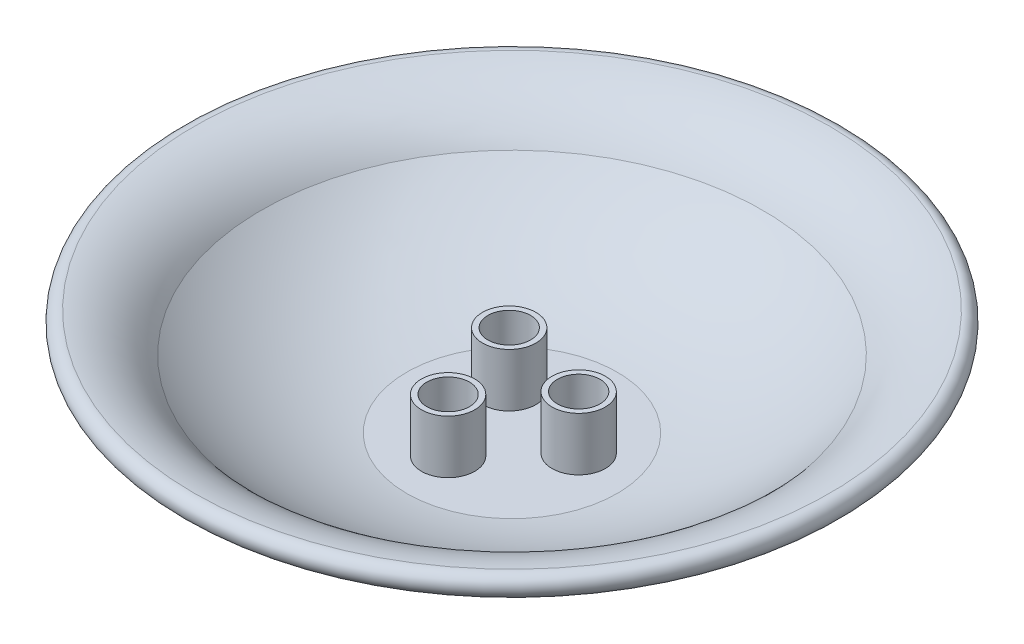
ISO-10303-21;
HEADER;
FILE_DESCRIPTION(('STEP AP214'),'2;1');
FILE_NAME('part.step','',(''),(''),'','','');
FILE_SCHEMA(('AUTOMOTIVE_DESIGN { 1 0 10303 214 1 1 1 1 }'));
ENDSEC;
DATA;
#1=APPLICATION_CONTEXT('core data for automotive mechanical design processes');
#2=APPLICATION_PROTOCOL_DEFINITION('international standard','automotive_design',2000,#1);
#3=PRODUCT_CONTEXT('',#1,'mechanical');
#4=PRODUCT('Part','Part','',(#3));
#5=PRODUCT_RELATED_PRODUCT_CATEGORY('part','',(#4));
#6=PRODUCT_DEFINITION_FORMATION('','',#4);
#7=PRODUCT_DEFINITION_CONTEXT('part definition',#1,'design');
#8=PRODUCT_DEFINITION('design','',#6,#7);
#9=PRODUCT_DEFINITION_SHAPE('','',#8);
#10=(LENGTH_UNIT() NAMED_UNIT(*) SI_UNIT(.MILLI.,.METRE.));
#11=(NAMED_UNIT(*) PLANE_ANGLE_UNIT() SI_UNIT($,.RADIAN.));
#12=(NAMED_UNIT(*) SI_UNIT($,.STERADIAN.) SOLID_ANGLE_UNIT());
#13=UNCERTAINTY_MEASURE_WITH_UNIT(LENGTH_MEASURE(1.E-05),#10,'distance_accuracy_value','');
#14=(GEOMETRIC_REPRESENTATION_CONTEXT(3) GLOBAL_UNCERTAINTY_ASSIGNED_CONTEXT((#13)) GLOBAL_UNIT_ASSIGNED_CONTEXT((#10,
#11,#12)) REPRESENTATION_CONTEXT('',''));
#15=CARTESIAN_POINT('',(0.,0.,0.));
#16=DIRECTION('',(0.,0.,1.));
#17=DIRECTION('',(1.,0.,0.));
#18=AXIS2_PLACEMENT_3D('',#15,#16,#17);
#19=CARTESIAN_POINT('',(13.1192660550459,6.17806077003984,0.));
#20=DIRECTION('',(0.,1.,0.));
#21=DIRECTION('',(0.,0.,1.));
#22=AXIS2_PLACEMENT_3D('',#19,#20,#21);
#23=TOROIDAL_SURFACE('',#22,29.8959735549191,1.);
#24=CARTESIAN_POINT('',(13.1192660550459,5.18348623853211,0.));
#25=DIRECTION('',(0.,1.,0.));
#26=DIRECTION('',(0.,0.,1.));
#27=AXIS2_PLACEMENT_3D('',#24,#25,#26);
#28=CIRCLE('',#27,30.);
#29=CARTESIAN_POINT('',(13.1192660550459,5.18348623853211,30.));
#30=VERTEX_POINT('',#29);
#31=EDGE_CURVE('E93',#30,#30,#28,.T.);
#32=ORIENTED_EDGE('',*,*,#31,.T.);
#33=EDGE_LOOP('',(#32));
#34=FACE_BOUND('',#33,.T.);
#35=CARTESIAN_POINT('',(13.1192660550459,7.17263530154758,0.));
#36=DIRECTION('',(0.,1.,0.));
#37=DIRECTION('',(0.,0.,1.));
#38=AXIS2_PLACEMENT_3D('',#35,#36,#37);
#39=CIRCLE('',#38,29.7919471098382);
#40=CARTESIAN_POINT('',(13.1192660550459,7.17263530154758,29.7919471098382));
#41=VERTEX_POINT('',#40);
#42=EDGE_CURVE('E10',#41,#41,#39,.T.);
#43=ORIENTED_EDGE('',*,*,#42,.F.);
#44=EDGE_LOOP('',(#43));
#45=FACE_BOUND('',#44,.T.);
#46=ADVANCED_FACE('F40',(#34,#45),#23,.T.);
#47=CARTESIAN_POINT('',(13.1192660550459,-1.67957037368538,0.));
#48=DIRECTION('',(0.,1.,0.));
#49=DIRECTION('',(0.,0.,1.));
#50=AXIS2_PLACEMENT_3D('',#47,#48,#49);
#51=TOROIDAL_SURFACE('',#50,30.7178339673305,8.90049503058699);
#52=ORIENTED_EDGE('',*,*,#42,.T.);
#53=EDGE_LOOP('',(#52));
#54=FACE_BOUND('',#53,.T.);
#55=CARTESIAN_POINT('',(13.1192660550459,3.51639603535897,0.));
#56=DIRECTION('',(0.,1.,0.));
#57=DIRECTION('',(0.,0.,1.));
#58=AXIS2_PLACEMENT_3D('',#55,#56,#57);
#59=CIRCLE('',#58,23.4914417232306);
#60=CARTESIAN_POINT('',(13.1192660550459,3.51639603535897,23.4914417232306));
#61=VERTEX_POINT('',#60);
#62=EDGE_CURVE('E47',#61,#61,#59,.T.);
#63=ORIENTED_EDGE('',*,*,#62,.F.);
#64=EDGE_LOOP('',(#63));
#65=FACE_BOUND('',#64,.T.);
#66=ADVANCED_FACE('F110',(#54,#65),#51,.T.);
#67=CARTESIAN_POINT('',(13.1192660550459,22.866819708958,0.));
#68=DIRECTION('',(0.,1.,0.));
#69=DIRECTION('',(0.,0.,1.));
#70=AXIS2_PLACEMENT_3D('',#67,#68,#69);
#71=DEGENERATE_TOROIDAL_SURFACE('',#70,6.21444438046789,25.9409624634402,.T.);
#72=ORIENTED_EDGE('',*,*,#62,.T.);
#73=EDGE_LOOP('',(#72));
#74=FACE_BOUND('',#73,.T.);
#75=CARTESIAN_POINT('',(13.1192660550459,-2.81651376146789,0.));
#76=DIRECTION('',(0.,1.,0.));
#77=DIRECTION('',(0.,0.,1.));
#78=AXIS2_PLACEMENT_3D('',#75,#76,#77);
#79=CIRCLE('',#78,9.86134928415182);
#80=CARTESIAN_POINT('',(13.1192660550459,-2.81651376146789,9.86134928415182));
#81=VERTEX_POINT('',#80);
#82=EDGE_CURVE('E52',#81,#81,#79,.T.);
#83=ORIENTED_EDGE('',*,*,#82,.F.);
#84=EDGE_LOOP('',(#83));
#85=FACE_BOUND('',#84,.T.);
#86=ADVANCED_FACE('F108',(#74,#85),#71,.F.);
#87=CARTESIAN_POINT('',(3.25791677089404,-2.81651376146789,0.));
#88=DIRECTION('',(0.,1.,0.));
#89=DIRECTION('',(0.,0.,1.));
#90=AXIS2_PLACEMENT_3D('',#87,#88,#89);
#91=PLANE('',#90);
#92=CARTESIAN_POINT('',(12.0041452804028,-2.81651376146789,4.87406459312548));
#93=DIRECTION('',(0.,1.,0.));
#94=DIRECTION('',(0.,0.,1.));
#95=AXIS2_PLACEMENT_3D('',#92,#93,#94);
#96=CIRCLE('',#95,2.5);
#97=CARTESIAN_POINT('',(12.0041452804028,-2.81651376146789,7.37406459312548));
#98=VERTEX_POINT('',#97);
#99=EDGE_CURVE('E67',#98,#98,#96,.T.);
#100=ORIENTED_EDGE('',*,*,#99,.F.);
#101=EDGE_LOOP('',(#100));
#102=FACE_BOUND('',#101,.T.);
#103=CARTESIAN_POINT('',(17.8978901997003,-2.81651376146789,-1.47130937743408));
#104=DIRECTION('',(0.,1.,0.));
#105=DIRECTION('',(0.,0.,1.));
#106=AXIS2_PLACEMENT_3D('',#103,#104,#105);
#107=CIRCLE('',#106,2.5);
#108=CARTESIAN_POINT('',(17.8978901997003,-2.81651376146789,1.02869062256592));
#109=VERTEX_POINT('',#108);
#110=EDGE_CURVE('E80',#109,#109,#107,.T.);
#111=ORIENTED_EDGE('',*,*,#110,.F.);
#112=EDGE_LOOP('',(#111));
#113=FACE_BOUND('',#112,.T.);
#114=CARTESIAN_POINT('',(9.45576268503444,-2.81651376146789,-3.40275521569139));
#115=DIRECTION('',(0.,1.,0.));
#116=DIRECTION('',(0.,0.,1.));
#117=AXIS2_PLACEMENT_3D('',#114,#115,#116);
#118=CIRCLE('',#117,2.5);
#119=CARTESIAN_POINT('',(9.45576268503444,-2.81651376146789,-0.902755215691387));
#120=VERTEX_POINT('',#119);
#121=EDGE_CURVE('E89',#120,#120,#118,.T.);
#122=ORIENTED_EDGE('',*,*,#121,.F.);
#123=EDGE_LOOP('',(#122));
#124=FACE_BOUND('',#123,.T.);
#125=ORIENTED_EDGE('',*,*,#82,.T.);
#126=EDGE_LOOP('',(#125));
#127=FACE_BOUND('',#126,.T.);
#128=ADVANCED_FACE('F106',(#102,#113,#124,#127),#91,.T.);
#129=CARTESIAN_POINT('',(3.11926605504587,-4.81651376146789,0.));
#130=DIRECTION('',(0.,-1.,0.));
#131=DIRECTION('',(0.,0.,-1.));
#132=AXIS2_PLACEMENT_3D('',#129,#130,#131);
#133=PLANE('',#132);
#134=CARTESIAN_POINT('',(17.8978901997003,-4.81651376146789,-1.47130937743408));
#135=DIRECTION('',(0.,-1.,0.));
#136=DIRECTION('',(0.,0.,-1.));
#137=AXIS2_PLACEMENT_3D('',#134,#135,#136);
#138=CIRCLE('',#137,2.);
#139=CARTESIAN_POINT('',(17.8978901997003,-4.81651376146789,-3.47130937743408));
#140=VERTEX_POINT('',#139);
#141=EDGE_CURVE('E43',#140,#140,#138,.T.);
#142=ORIENTED_EDGE('',*,*,#141,.F.);
#143=EDGE_LOOP('',(#142));
#144=FACE_BOUND('',#143,.T.);
#145=CARTESIAN_POINT('',(12.0041452804028,-4.81651376146789,4.87406459312548));
#146=DIRECTION('',(0.,-1.,0.));
#147=DIRECTION('',(0.,0.,-1.));
#148=AXIS2_PLACEMENT_3D('',#145,#146,#147);
#149=CIRCLE('',#148,2.);
#150=CARTESIAN_POINT('',(12.0041452804028,-4.81651376146789,2.87406459312548));
#151=VERTEX_POINT('',#150);
#152=EDGE_CURVE('E58',#151,#151,#149,.T.);
#153=ORIENTED_EDGE('',*,*,#152,.F.);
#154=EDGE_LOOP('',(#153));
#155=FACE_BOUND('',#154,.T.);
#156=CARTESIAN_POINT('',(9.45576268503444,-4.81651376146789,-3.40275521569139));
#157=DIRECTION('',(0.,-1.,0.));
#158=DIRECTION('',(0.,0.,-1.));
#159=AXIS2_PLACEMENT_3D('',#156,#157,#158);
#160=CIRCLE('',#159,2.);
#161=CARTESIAN_POINT('',(9.45576268503444,-4.81651376146789,-5.40275521569139));
#162=VERTEX_POINT('',#161);
#163=EDGE_CURVE('E56',#162,#162,#160,.T.);
#164=ORIENTED_EDGE('',*,*,#163,.F.);
#165=EDGE_LOOP('',(#164));
#166=FACE_BOUND('',#165,.T.);
#167=CARTESIAN_POINT('',(13.1192660550459,-4.81651376146789,0.));
#168=DIRECTION('',(0.,1.,0.));
#169=DIRECTION('',(0.,0.,1.));
#170=AXIS2_PLACEMENT_3D('',#167,#168,#169);
#171=CIRCLE('',#170,9.99999999999998);
#172=CARTESIAN_POINT('',(13.1192660550459,-4.81651376146789,9.99999999999998));
#173=VERTEX_POINT('',#172);
#174=EDGE_CURVE('E101',#173,#173,#171,.T.);
#175=ORIENTED_EDGE('',*,*,#174,.F.);
#176=EDGE_LOOP('',(#175));
#177=FACE_BOUND('',#176,.T.);
#178=ADVANCED_FACE('F117',(#144,#155,#166,#177),#133,.T.);
#179=CARTESIAN_POINT('',(13.1192660550459,22.866819708958,0.));
#180=DIRECTION('',(0.,1.,0.));
#181=DIRECTION('',(0.,0.,1.));
#182=AXIS2_PLACEMENT_3D('',#179,#180,#181);
#183=DEGENERATE_TOROIDAL_SURFACE('',#182,6.21444438046789,27.9409624634402,.T.);
#184=ORIENTED_EDGE('',*,*,#174,.T.);
#185=EDGE_LOOP('',(#184));
#186=FACE_BOUND('',#185,.T.);
#187=CARTESIAN_POINT('',(13.1192660550459,2.18348623853211,0.));
#188=DIRECTION('',(0.,1.,0.));
#189=DIRECTION('',(0.,0.,1.));
#190=AXIS2_PLACEMENT_3D('',#187,#188,#189);
#191=CIRCLE('',#190,25.);
#192=CARTESIAN_POINT('',(13.1192660550459,2.18348623853211,25.));
#193=VERTEX_POINT('',#192);
#194=EDGE_CURVE('E98',#193,#193,#191,.T.);
#195=ORIENTED_EDGE('',*,*,#194,.F.);
#196=EDGE_LOOP('',(#195));
#197=FACE_BOUND('',#196,.T.);
#198=ADVANCED_FACE('F130',(#186,#197),#183,.T.);
#199=CARTESIAN_POINT('',(13.1192660550459,-1.67957037368538,0.));
#200=DIRECTION('',(0.,1.,0.));
#201=DIRECTION('',(0.,0.,1.));
#202=AXIS2_PLACEMENT_3D('',#199,#200,#201);
#203=TOROIDAL_SURFACE('',#202,30.7178339673305,6.90049503058699);
#204=ORIENTED_EDGE('',*,*,#194,.T.);
#205=EDGE_LOOP('',(#204));
#206=FACE_BOUND('',#205,.T.);
#207=ORIENTED_EDGE('',*,*,#31,.F.);
#208=EDGE_LOOP('',(#207));
#209=FACE_BOUND('',#208,.T.);
#210=ADVANCED_FACE('F127',(#206,#209),#203,.F.);
#211=CARTESIAN_POINT('',(9.45576268503444,2.18348623853211,-3.40275521569139));
#212=DIRECTION('',(0.,1.,0.));
#213=DIRECTION('',(0.,0.,1.));
#214=AXIS2_PLACEMENT_3D('',#211,#212,#213);
#215=PLANE('',#214);
#216=CARTESIAN_POINT('',(9.45576268503444,2.18348623853211,-3.40275521569139));
#217=DIRECTION('',(0.,1.,0.));
#218=DIRECTION('',(0.,0.,1.));
#219=AXIS2_PLACEMENT_3D('',#216,#217,#218);
#220=CIRCLE('',#219,2.5);
#221=CARTESIAN_POINT('',(9.45576268503444,2.18348623853211,-0.902755215691387));
#222=VERTEX_POINT('',#221);
#223=EDGE_CURVE('E90',#222,#222,#220,.T.);
#224=ORIENTED_EDGE('',*,*,#223,.T.);
#225=EDGE_LOOP('',(#224));
#226=FACE_BOUND('',#225,.T.);
#227=CARTESIAN_POINT('',(9.45576268503444,2.18348623853211,-3.40275521569139));
#228=DIRECTION('',(0.,1.,0.));
#229=DIRECTION('',(0.,0.,1.));
#230=AXIS2_PLACEMENT_3D('',#227,#228,#229);
#231=CIRCLE('',#230,2.);
#232=CARTESIAN_POINT('',(9.45576268503444,2.18348623853211,-1.40275521569139));
#233=VERTEX_POINT('',#232);
#234=EDGE_CURVE('E84',#233,#233,#231,.T.);
#235=ORIENTED_EDGE('',*,*,#234,.F.);
#236=EDGE_LOOP('',(#235));
#237=FACE_BOUND('',#236,.T.);
#238=ADVANCED_FACE('F129',(#226,#237),#215,.T.);
#239=CARTESIAN_POINT('',(9.45576268503444,2.18348623853211,-3.40275521569139));
#240=DIRECTION('',(0.,-1.,0.));
#241=DIRECTION('',(0.,0.,-1.));
#242=AXIS2_PLACEMENT_3D('',#239,#240,#241);
#243=CYLINDRICAL_SURFACE('',#242,2.5);
#244=ORIENTED_EDGE('',*,*,#223,.F.);
#245=EDGE_LOOP('',(#244));
#246=FACE_BOUND('',#245,.T.);
#247=ORIENTED_EDGE('',*,*,#121,.T.);
#248=EDGE_LOOP('',(#247));
#249=FACE_BOUND('',#248,.T.);
#250=ADVANCED_FACE('F137',(#246,#249),#243,.T.);
#251=CARTESIAN_POINT('',(9.45576268503444,2.18348623853211,-3.40275521569139));
#252=DIRECTION('',(0.,-1.,0.));
#253=DIRECTION('',(0.,0.,-1.));
#254=AXIS2_PLACEMENT_3D('',#251,#252,#253);
#255=CYLINDRICAL_SURFACE('',#254,2.);
#256=ORIENTED_EDGE('',*,*,#234,.T.);
#257=EDGE_LOOP('',(#256));
#258=FACE_BOUND('',#257,.T.);
#259=ORIENTED_EDGE('',*,*,#163,.T.);
#260=EDGE_LOOP('',(#259));
#261=FACE_BOUND('',#260,.T.);
#262=ADVANCED_FACE('F156',(#258,#261),#255,.F.);
#263=CARTESIAN_POINT('',(17.8978901997003,2.18348623853211,-1.47130937743408));
#264=DIRECTION('',(0.,1.,0.));
#265=DIRECTION('',(0.,0.,1.));
#266=AXIS2_PLACEMENT_3D('',#263,#264,#265);
#267=PLANE('',#266);
#268=CARTESIAN_POINT('',(17.8978901997003,2.18348623853211,-1.47130937743408));
#269=DIRECTION('',(0.,1.,0.));
#270=DIRECTION('',(0.,0.,1.));
#271=AXIS2_PLACEMENT_3D('',#268,#269,#270);
#272=CIRCLE('',#271,2.5);
#273=CARTESIAN_POINT('',(17.8978901997003,2.18348623853211,1.02869062256592));
#274=VERTEX_POINT('',#273);
#275=EDGE_CURVE('E81',#274,#274,#272,.T.);
#276=ORIENTED_EDGE('',*,*,#275,.T.);
#277=EDGE_LOOP('',(#276));
#278=FACE_BOUND('',#277,.T.);
#279=CARTESIAN_POINT('',(17.8978901997003,2.18348623853211,-1.47130937743408));
#280=DIRECTION('',(0.,1.,0.));
#281=DIRECTION('',(0.,0.,1.));
#282=AXIS2_PLACEMENT_3D('',#279,#280,#281);
#283=CIRCLE('',#282,2.);
#284=CARTESIAN_POINT('',(17.8978901997003,2.18348623853211,0.528690622565919));
#285=VERTEX_POINT('',#284);
#286=EDGE_CURVE('E76',#285,#285,#283,.T.);
#287=ORIENTED_EDGE('',*,*,#286,.F.);
#288=EDGE_LOOP('',(#287));
#289=FACE_BOUND('',#288,.T.);
#290=ADVANCED_FACE('F158',(#278,#289),#267,.T.);
#291=CARTESIAN_POINT('',(17.8978901997003,2.18348623853211,-1.47130937743408));
#292=DIRECTION('',(0.,-1.,0.));
#293=DIRECTION('',(0.,0.,-1.));
#294=AXIS2_PLACEMENT_3D('',#291,#292,#293);
#295=CYLINDRICAL_SURFACE('',#294,2.5);
#296=ORIENTED_EDGE('',*,*,#275,.F.);
#297=EDGE_LOOP('',(#296));
#298=FACE_BOUND('',#297,.T.);
#299=ORIENTED_EDGE('',*,*,#110,.T.);
#300=EDGE_LOOP('',(#299));
#301=FACE_BOUND('',#300,.T.);
#302=ADVANCED_FACE('F165',(#298,#301),#295,.T.);
#303=CARTESIAN_POINT('',(17.8978901997003,2.18348623853211,-1.47130937743408));
#304=DIRECTION('',(0.,-1.,0.));
#305=DIRECTION('',(0.,0.,-1.));
#306=AXIS2_PLACEMENT_3D('',#303,#304,#305);
#307=CYLINDRICAL_SURFACE('',#306,2.);
#308=ORIENTED_EDGE('',*,*,#286,.T.);
#309=EDGE_LOOP('',(#308));
#310=FACE_BOUND('',#309,.T.);
#311=ORIENTED_EDGE('',*,*,#141,.T.);
#312=EDGE_LOOP('',(#311));
#313=FACE_BOUND('',#312,.T.);
#314=ADVANCED_FACE('F171',(#310,#313),#307,.F.);
#315=CARTESIAN_POINT('',(12.0041452804028,2.18348623853211,4.87406459312548));
#316=DIRECTION('',(0.,1.,0.));
#317=DIRECTION('',(0.,0.,1.));
#318=AXIS2_PLACEMENT_3D('',#315,#316,#317);
#319=PLANE('',#318);
#320=CARTESIAN_POINT('',(12.0041452804028,2.18348623853211,4.87406459312548));
#321=DIRECTION('',(0.,1.,0.));
#322=DIRECTION('',(0.,0.,1.));
#323=AXIS2_PLACEMENT_3D('',#320,#321,#322);
#324=CIRCLE('',#323,2.5);
#325=CARTESIAN_POINT('',(12.0041452804028,2.18348623853211,7.37406459312548));
#326=VERTEX_POINT('',#325);
#327=EDGE_CURVE('E72',#326,#326,#324,.T.);
#328=ORIENTED_EDGE('',*,*,#327,.T.);
#329=EDGE_LOOP('',(#328));
#330=FACE_BOUND('',#329,.T.);
#331=CARTESIAN_POINT('',(12.0041452804028,2.18348623853211,4.87406459312548));
#332=DIRECTION('',(0.,1.,0.));
#333=DIRECTION('',(0.,0.,1.));
#334=AXIS2_PLACEMENT_3D('',#331,#332,#333);
#335=CIRCLE('',#334,2.);
#336=CARTESIAN_POINT('',(12.0041452804028,2.18348623853211,6.87406459312548));
#337=VERTEX_POINT('',#336);
#338=EDGE_CURVE('E63',#337,#337,#335,.T.);
#339=ORIENTED_EDGE('',*,*,#338,.F.);
#340=EDGE_LOOP('',(#339));
#341=FACE_BOUND('',#340,.T.);
#342=ADVANCED_FACE('F176',(#330,#341),#319,.T.);
#343=CARTESIAN_POINT('',(12.0041452804028,2.18348623853211,4.87406459312548));
#344=DIRECTION('',(0.,-1.,0.));
#345=DIRECTION('',(0.,0.,-1.));
#346=AXIS2_PLACEMENT_3D('',#343,#344,#345);
#347=CYLINDRICAL_SURFACE('',#346,2.5);
#348=ORIENTED_EDGE('',*,*,#327,.F.);
#349=EDGE_LOOP('',(#348));
#350=FACE_BOUND('',#349,.T.);
#351=ORIENTED_EDGE('',*,*,#99,.T.);
#352=EDGE_LOOP('',(#351));
#353=FACE_BOUND('',#352,.T.);
#354=ADVANCED_FACE('F178',(#350,#353),#347,.T.);
#355=CARTESIAN_POINT('',(12.0041452804028,2.18348623853211,4.87406459312548));
#356=DIRECTION('',(0.,-1.,0.));
#357=DIRECTION('',(0.,0.,-1.));
#358=AXIS2_PLACEMENT_3D('',#355,#356,#357);
#359=CYLINDRICAL_SURFACE('',#358,2.);
#360=ORIENTED_EDGE('',*,*,#338,.T.);
#361=EDGE_LOOP('',(#360));
#362=FACE_BOUND('',#361,.T.);
#363=ORIENTED_EDGE('',*,*,#152,.T.);
#364=EDGE_LOOP('',(#363));
#365=FACE_BOUND('',#364,.T.);
#366=ADVANCED_FACE('F181',(#362,#365),#359,.F.);
#367=CLOSED_SHELL('',(#46,#66,#86,#128,#178,#198,#210,#238,#250,#262,#290,#302,#314,#342,#354,#366));
#368=MANIFOLD_SOLID_BREP('B2',#367);
#369=ADVANCED_BREP_SHAPE_REPRESENTATION('',(#18,#368),#14);
#370=SHAPE_DEFINITION_REPRESENTATION(#9,#369);
ENDSEC;
END-ISO-10303-21;
